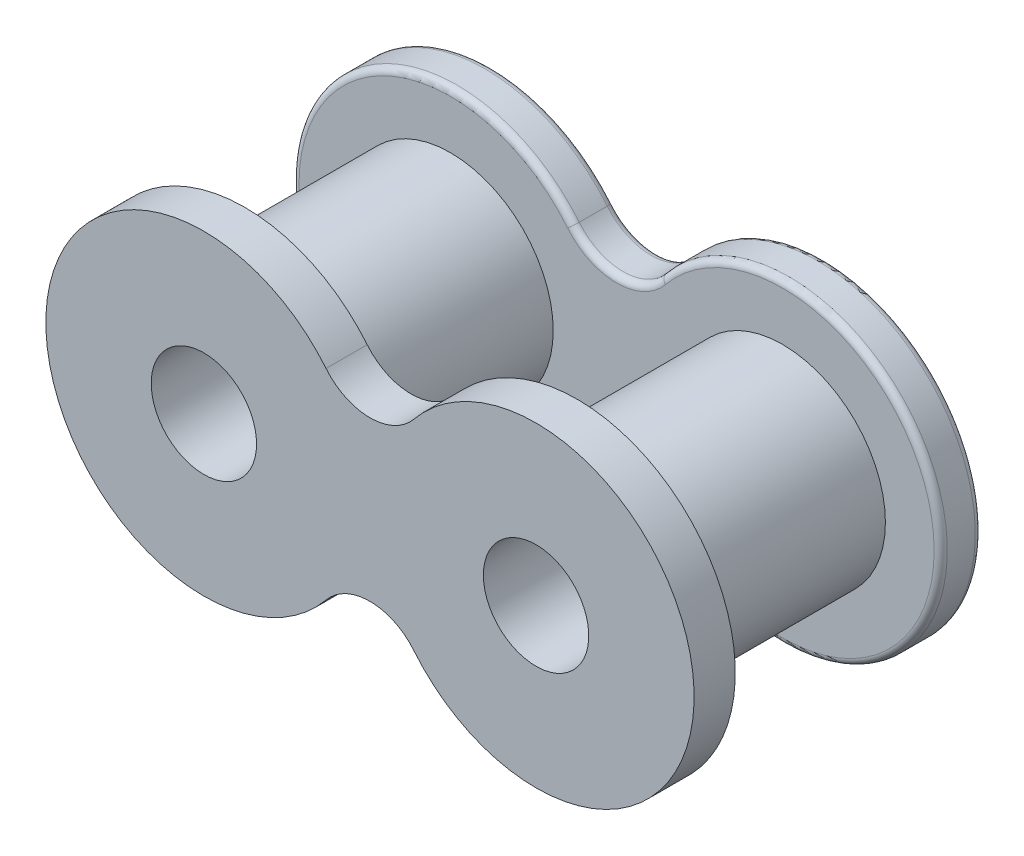
ISO-10303-21;
HEADER;
FILE_DESCRIPTION(('STEP AP214'),'2;1');
FILE_NAME('part.step','',(''),(''),'','','');
FILE_SCHEMA(('AUTOMOTIVE_DESIGN { 1 0 10303 214 1 1 1 1 }'));
ENDSEC;
DATA;
#1=APPLICATION_CONTEXT('core data for automotive mechanical design processes');
#2=APPLICATION_PROTOCOL_DEFINITION('international standard','automotive_design',2000,#1);
#3=PRODUCT_CONTEXT('',#1,'mechanical');
#4=PRODUCT('Part','Part','',(#3));
#5=PRODUCT_RELATED_PRODUCT_CATEGORY('part','',(#4));
#6=PRODUCT_DEFINITION_FORMATION('','',#4);
#7=PRODUCT_DEFINITION_CONTEXT('part definition',#1,'design');
#8=PRODUCT_DEFINITION('design','',#6,#7);
#9=PRODUCT_DEFINITION_SHAPE('','',#8);
#10=(LENGTH_UNIT() NAMED_UNIT(*) SI_UNIT(.MILLI.,.METRE.));
#11=(NAMED_UNIT(*) PLANE_ANGLE_UNIT() SI_UNIT($,.RADIAN.));
#12=(NAMED_UNIT(*) SI_UNIT($,.STERADIAN.) SOLID_ANGLE_UNIT());
#13=UNCERTAINTY_MEASURE_WITH_UNIT(LENGTH_MEASURE(1.E-05),#10,'distance_accuracy_value','');
#14=(GEOMETRIC_REPRESENTATION_CONTEXT(3) GLOBAL_UNCERTAINTY_ASSIGNED_CONTEXT((#13)) GLOBAL_UNIT_ASSIGNED_CONTEXT((#10,
#11,#12)) REPRESENTATION_CONTEXT('',''));
#15=CARTESIAN_POINT('',(0.,0.,0.));
#16=DIRECTION('',(0.,0.,1.));
#17=DIRECTION('',(1.,0.,0.));
#18=AXIS2_PLACEMENT_3D('',#15,#16,#17);
#19=CARTESIAN_POINT('',(3.20321277390089,2.62846689236439,1.5875));
#20=DIRECTION('',(0.,0.,1.));
#21=DIRECTION('',(1.,0.,0.));
#22=AXIS2_PLACEMENT_3D('',#19,#20,#21);
#23=PLANE('',#22);
#24=CARTESIAN_POINT('',(6.40642554780178,0.,1.5875));
#25=DIRECTION('',(0.,0.,1.));
#26=DIRECTION('',(1.,0.,0.));
#27=AXIS2_PLACEMENT_3D('',#24,#25,#26);
#28=CIRCLE('',#27,3.9624);
#29=CARTESIAN_POINT('',(10.3688255478018,0.,1.5875));
#30=VERTEX_POINT('',#29);
#31=EDGE_CURVE('E11',#30,#30,#28,.T.);
#32=ORIENTED_EDGE('',*,*,#31,.F.);
#33=EDGE_LOOP('',(#32));
#34=FACE_BOUND('',#33,.T.);
#35=CARTESIAN_POINT('',(-6.40642554780178,0.,1.5875));
#36=DIRECTION('',(0.,0.,1.));
#37=DIRECTION('',(1.,0.,0.));
#38=AXIS2_PLACEMENT_3D('',#35,#36,#37);
#39=CIRCLE('',#38,3.9624);
#40=CARTESIAN_POINT('',(-2.44402554780178,0.,1.5875));
#41=VERTEX_POINT('',#40);
#42=EDGE_CURVE('E176',#41,#41,#39,.T.);
#43=ORIENTED_EDGE('',*,*,#42,.F.);
#44=EDGE_LOOP('',(#43));
#45=FACE_BOUND('',#44,.T.);
#46=CARTESIAN_POINT('',(0.,-5.25693378472879,1.5875));
#47=DIRECTION('',(0.,0.,1.));
#48=DIRECTION('',(1.,0.,0.));
#49=AXIS2_PLACEMENT_3D('',#46,#47,#48);
#50=CIRCLE('',#49,2.4451974223226);
#51=CARTESIAN_POINT('',(-1.89026210400044,-3.70583752326953,1.5875));
#52=VERTEX_POINT('',#51);
#53=CARTESIAN_POINT('',(1.89026210400044,-3.70583752326953,1.5875));
#54=VERTEX_POINT('',#53);
#55=EDGE_CURVE('E48',#52,#54,#50,.F.);
#56=ORIENTED_EDGE('',*,*,#55,.T.);
#57=CARTESIAN_POINT('',(6.40642554780178,0.,1.5875));
#58=DIRECTION('',(0.,0.,1.));
#59=DIRECTION('',(1.,0.,0.));
#60=AXIS2_PLACEMENT_3D('',#57,#58,#59);
#61=CIRCLE('',#60,5.842);
#62=CARTESIAN_POINT('',(1.89026210400044,3.70583752326953,1.5875));
#63=VERTEX_POINT('',#62);
#64=EDGE_CURVE('E248',#54,#63,#61,.T.);
#65=ORIENTED_EDGE('',*,*,#64,.T.);
#66=CARTESIAN_POINT('',(0.,5.25693378472879,1.5875));
#67=DIRECTION('',(0.,0.,1.));
#68=DIRECTION('',(1.,0.,0.));
#69=AXIS2_PLACEMENT_3D('',#66,#67,#68);
#70=CIRCLE('',#69,2.4451974223226);
#71=CARTESIAN_POINT('',(-1.89026210400044,3.70583752326953,1.5875));
#72=VERTEX_POINT('',#71);
#73=EDGE_CURVE('E244',#63,#72,#70,.F.);
#74=ORIENTED_EDGE('',*,*,#73,.T.);
#75=CARTESIAN_POINT('',(-6.40642554780178,0.,1.5875));
#76=DIRECTION('',(0.,0.,1.));
#77=DIRECTION('',(1.,0.,0.));
#78=AXIS2_PLACEMENT_3D('',#75,#76,#77);
#79=CIRCLE('',#78,5.842);
#80=EDGE_CURVE('E53',#72,#52,#79,.T.);
#81=ORIENTED_EDGE('',*,*,#80,.T.);
#82=EDGE_LOOP('',(#56,#65,#74,#81));
#83=FACE_BOUND('',#82,.T.);
#84=ADVANCED_FACE('F33',(#34,#45,#83),#23,.T.);
#85=CARTESIAN_POINT('',(3.20321277390089,2.62846689236439,0.));
#86=DIRECTION('',(0.,0.,1.));
#87=DIRECTION('',(1.,0.,0.));
#88=AXIS2_PLACEMENT_3D('',#85,#86,#87);
#89=PLANE('',#88);
#90=CARTESIAN_POINT('',(6.40642554780178,0.,0.));
#91=DIRECTION('',(0.,0.,1.));
#92=DIRECTION('',(1.,0.,0.));
#93=AXIS2_PLACEMENT_3D('',#90,#91,#92);
#94=CIRCLE('',#93,2.286);
#95=CARTESIAN_POINT('',(8.69242554780178,0.,0.));
#96=VERTEX_POINT('',#95);
#97=EDGE_CURVE('E208',#96,#96,#94,.T.);
#98=ORIENTED_EDGE('',*,*,#97,.T.);
#99=EDGE_LOOP('',(#98));
#100=FACE_BOUND('',#99,.T.);
#101=CARTESIAN_POINT('',(-6.40642554780178,0.,0.));
#102=DIRECTION('',(0.,0.,1.));
#103=DIRECTION('',(1.,0.,0.));
#104=AXIS2_PLACEMENT_3D('',#101,#102,#103);
#105=CIRCLE('',#104,2.286);
#106=CARTESIAN_POINT('',(-4.12042554780178,0.,0.));
#107=VERTEX_POINT('',#106);
#108=EDGE_CURVE('E205',#107,#107,#105,.T.);
#109=ORIENTED_EDGE('',*,*,#108,.T.);
#110=EDGE_LOOP('',(#109));
#111=FACE_BOUND('',#110,.T.);
#112=CARTESIAN_POINT('',(0.,-5.25693378472879,0.));
#113=DIRECTION('',(0.,0.,1.));
#114=DIRECTION('',(1.,0.,0.));
#115=AXIS2_PLACEMENT_3D('',#112,#113,#114);
#116=CIRCLE('',#115,2.4451974223226);
#117=CARTESIAN_POINT('',(1.89026210400044,-3.70583752326953,0.));
#118=VERTEX_POINT('',#117);
#119=CARTESIAN_POINT('',(-1.89026210400044,-3.70583752326953,0.));
#120=VERTEX_POINT('',#119);
#121=EDGE_CURVE('E200',#118,#120,#116,.T.);
#122=ORIENTED_EDGE('',*,*,#121,.T.);
#123=CARTESIAN_POINT('',(-6.40642554780178,0.,0.));
#124=DIRECTION('',(0.,0.,1.));
#125=DIRECTION('',(1.,0.,0.));
#126=AXIS2_PLACEMENT_3D('',#123,#124,#125);
#127=CIRCLE('',#126,5.842);
#128=CARTESIAN_POINT('',(-1.89026210400044,3.70583752326953,0.));
#129=VERTEX_POINT('',#128);
#130=EDGE_CURVE('E202',#120,#129,#127,.F.);
#131=ORIENTED_EDGE('',*,*,#130,.T.);
#132=CARTESIAN_POINT('',(0.,5.25693378472879,0.));
#133=DIRECTION('',(0.,0.,1.));
#134=DIRECTION('',(1.,0.,0.));
#135=AXIS2_PLACEMENT_3D('',#132,#133,#134);
#136=CIRCLE('',#135,2.4451974223226);
#137=CARTESIAN_POINT('',(1.89026210400044,3.70583752326953,0.));
#138=VERTEX_POINT('',#137);
#139=EDGE_CURVE('E196',#129,#138,#136,.T.);
#140=ORIENTED_EDGE('',*,*,#139,.T.);
#141=CARTESIAN_POINT('',(6.40642554780178,0.,0.));
#142=DIRECTION('',(0.,0.,1.));
#143=DIRECTION('',(1.,0.,0.));
#144=AXIS2_PLACEMENT_3D('',#141,#142,#143);
#145=CIRCLE('',#144,5.842);
#146=EDGE_CURVE('E198',#138,#118,#145,.F.);
#147=ORIENTED_EDGE('',*,*,#146,.T.);
#148=EDGE_LOOP('',(#122,#131,#140,#147));
#149=FACE_BOUND('',#148,.T.);
#150=ADVANCED_FACE('F310',(#100,#111,#149),#89,.F.);
#151=CARTESIAN_POINT('',(0.,5.25693378472879,1.5875));
#152=DIRECTION('',(0.,0.,-1.));
#153=DIRECTION('',(-1.,0.,0.));
#154=AXIS2_PLACEMENT_3D('',#151,#152,#153);
#155=CYLINDRICAL_SURFACE('',#154,2.1911974223226);
#156=DIRECTION('',(0.,0.,-1.));
#157=VECTOR('',#156,1.);
#158=CARTESIAN_POINT('',(1.69390717166126,3.86696089384646,1.5875));
#159=LINE('',#158,#157);
#160=CARTESIAN_POINT('',(1.69390717166126,3.86696089384646,1.3335));
#161=VERTEX_POINT('',#160);
#162=CARTESIAN_POINT('',(1.69390717166126,3.86696089384646,0.254));
#163=VERTEX_POINT('',#162);
#164=EDGE_CURVE('E183',#161,#163,#159,.T.);
#165=ORIENTED_EDGE('',*,*,#164,.T.);
#166=CARTESIAN_POINT('',(0.,5.25693378472879,0.254));
#167=DIRECTION('',(0.,0.,1.));
#168=DIRECTION('',(1.,0.,0.));
#169=AXIS2_PLACEMENT_3D('',#166,#167,#168);
#170=CIRCLE('',#169,2.1911974223226);
#171=CARTESIAN_POINT('',(-1.69390717166125,3.86696089384646,0.254));
#172=VERTEX_POINT('',#171);
#173=EDGE_CURVE('E239',#163,#172,#170,.F.);
#174=ORIENTED_EDGE('',*,*,#173,.T.);
#175=DIRECTION('',(0.,0.,-1.));
#176=VECTOR('',#175,1.);
#177=CARTESIAN_POINT('',(-1.69390717166125,3.86696089384646,1.5875));
#178=LINE('',#177,#176);
#179=CARTESIAN_POINT('',(-1.69390717166125,3.86696089384646,1.3335));
#180=VERTEX_POINT('',#179);
#181=EDGE_CURVE('E193',#180,#172,#178,.T.);
#182=ORIENTED_EDGE('',*,*,#181,.F.);
#183=CARTESIAN_POINT('',(0.,5.25693378472879,1.3335));
#184=DIRECTION('',(0.,0.,1.));
#185=DIRECTION('',(1.,0.,0.));
#186=AXIS2_PLACEMENT_3D('',#183,#184,#185);
#187=CIRCLE('',#186,2.1911974223226);
#188=EDGE_CURVE('E237',#180,#161,#187,.T.);
#189=ORIENTED_EDGE('',*,*,#188,.T.);
#190=EDGE_LOOP('',(#165,#174,#182,#189));
#191=FACE_BOUND('',#190,.T.);
#192=ADVANCED_FACE('F282',(#191),#155,.F.);
#193=CARTESIAN_POINT('',(-6.40642554780178,0.,1.5875));
#194=DIRECTION('',(0.,0.,-1.));
#195=DIRECTION('',(-1.,0.,0.));
#196=AXIS2_PLACEMENT_3D('',#193,#194,#195);
#197=CYLINDRICAL_SURFACE('',#196,6.096);
#198=ORIENTED_EDGE('',*,*,#181,.T.);
#199=CARTESIAN_POINT('',(-6.40642554780178,0.,0.254));
#200=DIRECTION('',(0.,0.,1.));
#201=DIRECTION('',(1.,0.,0.));
#202=AXIS2_PLACEMENT_3D('',#199,#200,#201);
#203=CIRCLE('',#202,6.096);
#204=CARTESIAN_POINT('',(-1.69390717166126,-3.86696089384646,0.254));
#205=VERTEX_POINT('',#204);
#206=EDGE_CURVE('E225',#172,#205,#203,.T.);
#207=ORIENTED_EDGE('',*,*,#206,.T.);
#208=DIRECTION('',(0.,0.,-1.));
#209=VECTOR('',#208,1.);
#210=CARTESIAN_POINT('',(-1.69390717166126,-3.86696089384646,1.5875));
#211=LINE('',#210,#209);
#212=CARTESIAN_POINT('',(-1.69390717166126,-3.86696089384646,1.3335));
#213=VERTEX_POINT('',#212);
#214=EDGE_CURVE('E190',#213,#205,#211,.T.);
#215=ORIENTED_EDGE('',*,*,#214,.F.);
#216=CARTESIAN_POINT('',(-6.40642554780178,0.,1.3335));
#217=DIRECTION('',(0.,0.,1.));
#218=DIRECTION('',(1.,0.,0.));
#219=AXIS2_PLACEMENT_3D('',#216,#217,#218);
#220=CIRCLE('',#219,6.096);
#221=EDGE_CURVE('E223',#213,#180,#220,.F.);
#222=ORIENTED_EDGE('',*,*,#221,.T.);
#223=EDGE_LOOP('',(#198,#207,#215,#222));
#224=FACE_BOUND('',#223,.T.);
#225=ADVANCED_FACE('F279',(#224),#197,.T.);
#226=CARTESIAN_POINT('',(0.,-5.25693378472879,1.5875));
#227=DIRECTION('',(0.,0.,-1.));
#228=DIRECTION('',(-1.,0.,0.));
#229=AXIS2_PLACEMENT_3D('',#226,#227,#228);
#230=CYLINDRICAL_SURFACE('',#229,2.1911974223226);
#231=ORIENTED_EDGE('',*,*,#214,.T.);
#232=CARTESIAN_POINT('',(0.,-5.25693378472879,0.254));
#233=DIRECTION('',(0.,0.,1.));
#234=DIRECTION('',(1.,0.,0.));
#235=AXIS2_PLACEMENT_3D('',#232,#233,#234);
#236=CIRCLE('',#235,2.1911974223226);
#237=CARTESIAN_POINT('',(1.69390717166126,-3.86696089384646,0.254));
#238=VERTEX_POINT('',#237);
#239=EDGE_CURVE('E230',#205,#238,#236,.F.);
#240=ORIENTED_EDGE('',*,*,#239,.T.);
#241=DIRECTION('',(0.,0.,-1.));
#242=VECTOR('',#241,1.);
#243=CARTESIAN_POINT('',(1.69390717166126,-3.86696089384646,1.5875));
#244=LINE('',#243,#242);
#245=CARTESIAN_POINT('',(1.69390717166126,-3.86696089384646,1.3335));
#246=VERTEX_POINT('',#245);
#247=EDGE_CURVE('E186',#246,#238,#244,.T.);
#248=ORIENTED_EDGE('',*,*,#247,.F.);
#249=CARTESIAN_POINT('',(0.,-5.25693378472879,1.3335));
#250=DIRECTION('',(0.,0.,1.));
#251=DIRECTION('',(1.,0.,0.));
#252=AXIS2_PLACEMENT_3D('',#249,#250,#251);
#253=CIRCLE('',#252,2.1911974223226);
#254=EDGE_CURVE('E228',#246,#213,#253,.T.);
#255=ORIENTED_EDGE('',*,*,#254,.T.);
#256=EDGE_LOOP('',(#231,#240,#248,#255));
#257=FACE_BOUND('',#256,.T.);
#258=ADVANCED_FACE('F296',(#257),#230,.F.);
#259=CARTESIAN_POINT('',(6.40642554780178,0.,1.5875));
#260=DIRECTION('',(0.,0.,-1.));
#261=DIRECTION('',(-1.,0.,0.));
#262=AXIS2_PLACEMENT_3D('',#259,#260,#261);
#263=CYLINDRICAL_SURFACE('',#262,6.096);
#264=ORIENTED_EDGE('',*,*,#247,.T.);
#265=CARTESIAN_POINT('',(6.40642554780178,0.,0.254));
#266=DIRECTION('',(0.,0.,1.));
#267=DIRECTION('',(1.,0.,0.));
#268=AXIS2_PLACEMENT_3D('',#265,#266,#267);
#269=CIRCLE('',#268,6.096);
#270=EDGE_CURVE('E235',#238,#163,#269,.T.);
#271=ORIENTED_EDGE('',*,*,#270,.T.);
#272=ORIENTED_EDGE('',*,*,#164,.F.);
#273=CARTESIAN_POINT('',(6.40642554780178,0.,1.3335));
#274=DIRECTION('',(0.,0.,1.));
#275=DIRECTION('',(1.,0.,0.));
#276=AXIS2_PLACEMENT_3D('',#273,#274,#275);
#277=CIRCLE('',#276,6.096);
#278=EDGE_CURVE('E232',#161,#246,#277,.F.);
#279=ORIENTED_EDGE('',*,*,#278,.T.);
#280=EDGE_LOOP('',(#264,#271,#272,#279));
#281=FACE_BOUND('',#280,.T.);
#282=ADVANCED_FACE('F300',(#281),#263,.T.);
#283=CARTESIAN_POINT('',(-6.40642554780178,0.,1.5875));
#284=DIRECTION('',(0.,0.,-1.));
#285=DIRECTION('',(-1.,0.,0.));
#286=AXIS2_PLACEMENT_3D('',#283,#284,#285);
#287=CYLINDRICAL_SURFACE('',#286,2.032);
#288=CARTESIAN_POINT('',(-6.40642554780178,0.,0.254));
#289=DIRECTION('',(0.,0.,1.));
#290=DIRECTION('',(1.,0.,0.));
#291=AXIS2_PLACEMENT_3D('',#288,#289,#290);
#292=CIRCLE('',#291,2.032);
#293=CARTESIAN_POINT('',(-4.37442554780178,0.,0.254));
#294=VERTEX_POINT('',#293);
#295=EDGE_CURVE('E220',#294,#294,#292,.F.);
#296=ORIENTED_EDGE('',*,*,#295,.T.);
#297=EDGE_LOOP('',(#296));
#298=FACE_BOUND('',#297,.T.);
#299=CARTESIAN_POINT('',(-6.40642554780178,0.,1.3335));
#300=DIRECTION('',(0.,0.,1.));
#301=DIRECTION('',(1.,0.,0.));
#302=AXIS2_PLACEMENT_3D('',#299,#300,#301);
#303=CIRCLE('',#302,2.032);
#304=CARTESIAN_POINT('',(-4.37442554780178,0.,1.3335));
#305=VERTEX_POINT('',#304);
#306=EDGE_CURVE('E217',#305,#305,#303,.T.);
#307=ORIENTED_EDGE('',*,*,#306,.T.);
#308=EDGE_LOOP('',(#307));
#309=FACE_BOUND('',#308,.T.);
#310=ADVANCED_FACE('F326',(#298,#309),#287,.F.);
#311=CARTESIAN_POINT('',(6.40642554780178,0.,1.5875));
#312=DIRECTION('',(0.,0.,-1.));
#313=DIRECTION('',(-1.,0.,0.));
#314=AXIS2_PLACEMENT_3D('',#311,#312,#313);
#315=CYLINDRICAL_SURFACE('',#314,2.032);
#316=CARTESIAN_POINT('',(6.40642554780178,0.,0.254));
#317=DIRECTION('',(0.,0.,1.));
#318=DIRECTION('',(1.,0.,0.));
#319=AXIS2_PLACEMENT_3D('',#316,#317,#318);
#320=CIRCLE('',#319,2.032);
#321=CARTESIAN_POINT('',(8.43842554780178,0.,0.254));
#322=VERTEX_POINT('',#321);
#323=EDGE_CURVE('E214',#322,#322,#320,.F.);
#324=ORIENTED_EDGE('',*,*,#323,.T.);
#325=EDGE_LOOP('',(#324));
#326=FACE_BOUND('',#325,.T.);
#327=CARTESIAN_POINT('',(6.40642554780178,0.,1.3335));
#328=DIRECTION('',(0.,0.,1.));
#329=DIRECTION('',(1.,0.,0.));
#330=AXIS2_PLACEMENT_3D('',#327,#328,#329);
#331=CIRCLE('',#330,2.032);
#332=CARTESIAN_POINT('',(8.43842554780178,0.,1.3335));
#333=VERTEX_POINT('',#332);
#334=EDGE_CURVE('E211',#333,#333,#331,.T.);
#335=ORIENTED_EDGE('',*,*,#334,.T.);
#336=EDGE_LOOP('',(#335));
#337=FACE_BOUND('',#336,.T.);
#338=ADVANCED_FACE('F335',(#326,#337),#315,.F.);
#339=CARTESIAN_POINT('',(6.40642554780178,0.,0.254));
#340=DIRECTION('',(0.,0.,1.));
#341=DIRECTION('',(1.,0.,0.));
#342=AXIS2_PLACEMENT_3D('',#339,#340,#341);
#343=TOROIDAL_SURFACE('',#342,2.286,0.254);
#344=ORIENTED_EDGE('',*,*,#323,.F.);
#345=EDGE_LOOP('',(#344));
#346=FACE_BOUND('',#345,.T.);
#347=ORIENTED_EDGE('',*,*,#97,.F.);
#348=EDGE_LOOP('',(#347));
#349=FACE_BOUND('',#348,.T.);
#350=ADVANCED_FACE('F331',(#346,#349),#343,.T.);
#351=CARTESIAN_POINT('',(-6.40642554780178,0.,0.254));
#352=DIRECTION('',(0.,0.,1.));
#353=DIRECTION('',(1.,0.,0.));
#354=AXIS2_PLACEMENT_3D('',#351,#352,#353);
#355=TOROIDAL_SURFACE('',#354,2.286,0.254);
#356=ORIENTED_EDGE('',*,*,#295,.F.);
#357=EDGE_LOOP('',(#356));
#358=FACE_BOUND('',#357,.T.);
#359=ORIENTED_EDGE('',*,*,#108,.F.);
#360=EDGE_LOOP('',(#359));
#361=FACE_BOUND('',#360,.T.);
#362=ADVANCED_FACE('F334',(#358,#361),#355,.T.);
#363=CARTESIAN_POINT('',(6.40642554780178,0.,0.254));
#364=DIRECTION('',(0.,0.,1.));
#365=DIRECTION('',(1.,0.,0.));
#366=AXIS2_PLACEMENT_3D('',#363,#364,#365);
#367=TOROIDAL_SURFACE('',#366,5.842,0.254);
#368=CARTESIAN_POINT('',(1.89026210400044,-3.70583752326953,0.254));
#369=DIRECTION('',(-0.634343978649354,0.773050914721216,0.));
#370=DIRECTION('',(-0.773050914721216,-0.634343978649354,0.));
#371=AXIS2_PLACEMENT_3D('',#368,#369,#370);
#372=CIRCLE('',#371,0.254);
#373=EDGE_CURVE('E257',#118,#238,#372,.T.);
#374=ORIENTED_EDGE('',*,*,#373,.F.);
#375=ORIENTED_EDGE('',*,*,#146,.F.);
#376=CARTESIAN_POINT('',(1.89026210400044,3.70583752326953,0.254));
#377=DIRECTION('',(-0.634343978649354,-0.773050914721215,0.));
#378=DIRECTION('',(0.773050914721215,-0.634343978649354,0.));
#379=AXIS2_PLACEMENT_3D('',#376,#377,#378);
#380=CIRCLE('',#379,0.254);
#381=EDGE_CURVE('E187',#163,#138,#380,.T.);
#382=ORIENTED_EDGE('',*,*,#381,.F.);
#383=ORIENTED_EDGE('',*,*,#270,.F.);
#384=EDGE_LOOP('',(#374,#375,#382,#383));
#385=FACE_BOUND('',#384,.T.);
#386=ADVANCED_FACE('F304',(#385),#367,.T.);
#387=CARTESIAN_POINT('',(0.,5.25693378472879,0.254));
#388=DIRECTION('',(0.,0.,1.));
#389=DIRECTION('',(1.,0.,0.));
#390=AXIS2_PLACEMENT_3D('',#387,#388,#389);
#391=TOROIDAL_SURFACE('',#390,2.4451974223226,0.254);
#392=ORIENTED_EDGE('',*,*,#381,.T.);
#393=ORIENTED_EDGE('',*,*,#139,.F.);
#394=CARTESIAN_POINT('',(-1.89026210400044,3.70583752326953,0.254));
#395=DIRECTION('',(-0.634343978649354,0.773050914721215,0.));
#396=DIRECTION('',(-0.773050914721215,-0.634343978649354,0.));
#397=AXIS2_PLACEMENT_3D('',#394,#395,#396);
#398=CIRCLE('',#397,0.254);
#399=EDGE_CURVE('E254',#172,#129,#398,.T.);
#400=ORIENTED_EDGE('',*,*,#399,.F.);
#401=ORIENTED_EDGE('',*,*,#173,.F.);
#402=EDGE_LOOP('',(#392,#393,#400,#401));
#403=FACE_BOUND('',#402,.T.);
#404=ADVANCED_FACE('F287',(#403),#391,.T.);
#405=CARTESIAN_POINT('',(0.,-5.25693378472879,0.254));
#406=DIRECTION('',(0.,0.,1.));
#407=DIRECTION('',(1.,0.,0.));
#408=AXIS2_PLACEMENT_3D('',#405,#406,#407);
#409=TOROIDAL_SURFACE('',#408,2.4451974223226,0.254);
#410=ORIENTED_EDGE('',*,*,#373,.T.);
#411=ORIENTED_EDGE('',*,*,#239,.F.);
#412=CARTESIAN_POINT('',(-1.89026210400044,-3.70583752326953,0.254));
#413=DIRECTION('',(-0.634343978649354,-0.773050914721215,0.));
#414=DIRECTION('',(0.773050914721215,-0.634343978649354,0.));
#415=AXIS2_PLACEMENT_3D('',#412,#413,#414);
#416=CIRCLE('',#415,0.254);
#417=EDGE_CURVE('E252',#120,#205,#416,.T.);
#418=ORIENTED_EDGE('',*,*,#417,.F.);
#419=ORIENTED_EDGE('',*,*,#121,.F.);
#420=EDGE_LOOP('',(#410,#411,#418,#419));
#421=FACE_BOUND('',#420,.T.);
#422=ADVANCED_FACE('F308',(#421),#409,.T.);
#423=CARTESIAN_POINT('',(-6.40642554780178,0.,0.254));
#424=DIRECTION('',(0.,0.,1.));
#425=DIRECTION('',(1.,0.,0.));
#426=AXIS2_PLACEMENT_3D('',#423,#424,#425);
#427=TOROIDAL_SURFACE('',#426,5.842,0.254);
#428=ORIENTED_EDGE('',*,*,#399,.T.);
#429=ORIENTED_EDGE('',*,*,#130,.F.);
#430=ORIENTED_EDGE('',*,*,#417,.T.);
#431=ORIENTED_EDGE('',*,*,#206,.F.);
#432=EDGE_LOOP('',(#428,#429,#430,#431));
#433=FACE_BOUND('',#432,.T.);
#434=ADVANCED_FACE('F292',(#433),#427,.T.);
#435=CARTESIAN_POINT('',(6.40642554780178,0.,1.3335));
#436=DIRECTION('',(0.,0.,1.));
#437=DIRECTION('',(1.,0.,0.));
#438=AXIS2_PLACEMENT_3D('',#435,#436,#437);
#439=TOROIDAL_SURFACE('',#438,2.286,0.254);
#440=CARTESIAN_POINT('',(6.40642554780178,0.,1.5875));
#441=DIRECTION('',(0.,0.,1.));
#442=DIRECTION('',(1.,0.,0.));
#443=AXIS2_PLACEMENT_3D('',#440,#441,#442);
#444=CIRCLE('',#443,2.286);
#445=CARTESIAN_POINT('',(8.69242554780178,0.,1.5875));
#446=VERTEX_POINT('',#445);
#447=EDGE_CURVE('E41',#446,#446,#444,.F.);
#448=ORIENTED_EDGE('',*,*,#447,.F.);
#449=EDGE_LOOP('',(#448));
#450=FACE_BOUND('',#449,.T.);
#451=ORIENTED_EDGE('',*,*,#334,.F.);
#452=EDGE_LOOP('',(#451));
#453=FACE_BOUND('',#452,.T.);
#454=ADVANCED_FACE('F342',(#450,#453),#439,.T.);
#455=CARTESIAN_POINT('',(-6.40642554780178,0.,1.3335));
#456=DIRECTION('',(0.,0.,1.));
#457=DIRECTION('',(1.,0.,0.));
#458=AXIS2_PLACEMENT_3D('',#455,#456,#457);
#459=TOROIDAL_SURFACE('',#458,5.842,0.254);
#460=CARTESIAN_POINT('',(-1.89026210400044,3.70583752326953,1.3335));
#461=DIRECTION('',(0.634343978649354,-0.773050914721215,0.));
#462=DIRECTION('',(0.773050914721215,0.634343978649354,0.));
#463=AXIS2_PLACEMENT_3D('',#460,#461,#462);
#464=CIRCLE('',#463,0.254);
#465=EDGE_CURVE('E265',#180,#72,#464,.T.);
#466=ORIENTED_EDGE('',*,*,#465,.F.);
#467=ORIENTED_EDGE('',*,*,#221,.F.);
#468=CARTESIAN_POINT('',(-1.89026210400044,-3.70583752326953,1.3335));
#469=DIRECTION('',(0.634343978649354,0.773050914721216,0.));
#470=DIRECTION('',(-0.773050914721216,0.634343978649354,0.));
#471=AXIS2_PLACEMENT_3D('',#468,#469,#470);
#472=CIRCLE('',#471,0.254);
#473=EDGE_CURVE('E255',#52,#213,#472,.T.);
#474=ORIENTED_EDGE('',*,*,#473,.F.);
#475=ORIENTED_EDGE('',*,*,#80,.F.);
#476=EDGE_LOOP('',(#466,#467,#474,#475));
#477=FACE_BOUND('',#476,.T.);
#478=ADVANCED_FACE('F274',(#477),#459,.T.);
#479=CARTESIAN_POINT('',(0.,-5.25693378472879,1.3335));
#480=DIRECTION('',(0.,0.,1.));
#481=DIRECTION('',(1.,0.,0.));
#482=AXIS2_PLACEMENT_3D('',#479,#480,#481);
#483=TOROIDAL_SURFACE('',#482,2.4451974223226,0.254);
#484=ORIENTED_EDGE('',*,*,#473,.T.);
#485=ORIENTED_EDGE('',*,*,#254,.F.);
#486=CARTESIAN_POINT('',(1.89026210400044,-3.70583752326953,1.3335));
#487=DIRECTION('',(0.634343978649354,-0.773050914721215,0.));
#488=DIRECTION('',(0.773050914721215,0.634343978649354,0.));
#489=AXIS2_PLACEMENT_3D('',#486,#487,#488);
#490=CIRCLE('',#489,0.254);
#491=EDGE_CURVE('E263',#54,#246,#490,.T.);
#492=ORIENTED_EDGE('',*,*,#491,.F.);
#493=ORIENTED_EDGE('',*,*,#55,.F.);
#494=EDGE_LOOP('',(#484,#485,#492,#493));
#495=FACE_BOUND('',#494,.T.);
#496=ADVANCED_FACE('F270',(#495),#483,.T.);
#497=CARTESIAN_POINT('',(0.,5.25693378472879,1.3335));
#498=DIRECTION('',(0.,0.,1.));
#499=DIRECTION('',(1.,0.,0.));
#500=AXIS2_PLACEMENT_3D('',#497,#498,#499);
#501=TOROIDAL_SURFACE('',#500,2.4451974223226,0.254);
#502=ORIENTED_EDGE('',*,*,#465,.T.);
#503=ORIENTED_EDGE('',*,*,#73,.F.);
#504=CARTESIAN_POINT('',(1.89026210400044,3.70583752326953,1.3335));
#505=DIRECTION('',(0.634343978649354,0.773050914721216,0.));
#506=DIRECTION('',(-0.773050914721216,0.634343978649354,0.));
#507=AXIS2_PLACEMENT_3D('',#504,#505,#506);
#508=CIRCLE('',#507,0.254);
#509=EDGE_CURVE('E180',#161,#63,#508,.T.);
#510=ORIENTED_EDGE('',*,*,#509,.F.);
#511=ORIENTED_EDGE('',*,*,#188,.F.);
#512=EDGE_LOOP('',(#502,#503,#510,#511));
#513=FACE_BOUND('',#512,.T.);
#514=ADVANCED_FACE('F355',(#513),#501,.T.);
#515=CARTESIAN_POINT('',(6.40642554780178,0.,1.3335));
#516=DIRECTION('',(0.,0.,1.));
#517=DIRECTION('',(1.,0.,0.));
#518=AXIS2_PLACEMENT_3D('',#515,#516,#517);
#519=TOROIDAL_SURFACE('',#518,5.842,0.254);
#520=ORIENTED_EDGE('',*,*,#491,.T.);
#521=ORIENTED_EDGE('',*,*,#278,.F.);
#522=ORIENTED_EDGE('',*,*,#509,.T.);
#523=ORIENTED_EDGE('',*,*,#64,.F.);
#524=EDGE_LOOP('',(#520,#521,#522,#523));
#525=FACE_BOUND('',#524,.T.);
#526=ADVANCED_FACE('F352',(#525),#519,.T.);
#527=CARTESIAN_POINT('',(-6.40642554780178,0.,1.3335));
#528=DIRECTION('',(0.,0.,1.));
#529=DIRECTION('',(1.,0.,0.));
#530=AXIS2_PLACEMENT_3D('',#527,#528,#529);
#531=TOROIDAL_SURFACE('',#530,2.286,0.254);
#532=CARTESIAN_POINT('',(-6.40642554780178,0.,1.5875));
#533=DIRECTION('',(0.,0.,1.));
#534=DIRECTION('',(1.,0.,0.));
#535=AXIS2_PLACEMENT_3D('',#532,#533,#534);
#536=CIRCLE('',#535,2.286);
#537=CARTESIAN_POINT('',(-4.12042554780178,0.,1.5875));
#538=VERTEX_POINT('',#537);
#539=EDGE_CURVE('E241',#538,#538,#536,.F.);
#540=ORIENTED_EDGE('',*,*,#539,.F.);
#541=EDGE_LOOP('',(#540));
#542=FACE_BOUND('',#541,.T.);
#543=ORIENTED_EDGE('',*,*,#306,.F.);
#544=EDGE_LOOP('',(#543));
#545=FACE_BOUND('',#544,.T.);
#546=ADVANCED_FACE('F35',(#542,#545),#531,.T.);
#547=CARTESIAN_POINT('',(-6.40642554780178,0.,1.5875));
#548=DIRECTION('',(0.,0.,1.));
#549=DIRECTION('',(1.,0.,0.));
#550=AXIS2_PLACEMENT_3D('',#547,#548,#549);
#551=PLANE('',#550);
#552=CARTESIAN_POINT('',(-6.40642554780178,0.,1.5875));
#553=DIRECTION('',(0.,0.,1.));
#554=DIRECTION('',(1.,0.,0.));
#555=AXIS2_PLACEMENT_3D('',#552,#553,#554);
#556=CIRCLE('',#555,2.032);
#557=CARTESIAN_POINT('',(-4.37442554780178,0.,1.5875));
#558=VERTEX_POINT('',#557);
#559=EDGE_CURVE('E173',#558,#558,#556,.T.);
#560=ORIENTED_EDGE('',*,*,#559,.T.);
#561=EDGE_LOOP('',(#560));
#562=FACE_BOUND('',#561,.T.);
#563=ORIENTED_EDGE('',*,*,#539,.T.);
#564=EDGE_LOOP('',(#563));
#565=FACE_BOUND('',#564,.T.);
#566=ADVANCED_FACE('F384',(#562,#565),#551,.F.);
#567=CARTESIAN_POINT('',(-6.40642554780178,0.,9.5123));
#568=DIRECTION('',(0.,0.,-1.));
#569=DIRECTION('',(-1.,0.,0.));
#570=AXIS2_PLACEMENT_3D('',#567,#568,#569);
#571=CYLINDRICAL_SURFACE('',#570,3.9624);
#572=CARTESIAN_POINT('',(-6.40642554780178,0.,9.5123));
#573=DIRECTION('',(0.,0.,1.));
#574=DIRECTION('',(1.,0.,0.));
#575=AXIS2_PLACEMENT_3D('',#572,#573,#574);
#576=CIRCLE('',#575,3.9624);
#577=CARTESIAN_POINT('',(-2.44402554780178,0.,9.5123));
#578=VERTEX_POINT('',#577);
#579=EDGE_CURVE('E177',#578,#578,#576,.T.);
#580=ORIENTED_EDGE('',*,*,#579,.F.);
#581=EDGE_LOOP('',(#580));
#582=FACE_BOUND('',#581,.T.);
#583=ORIENTED_EDGE('',*,*,#42,.T.);
#584=EDGE_LOOP('',(#583));
#585=FACE_BOUND('',#584,.T.);
#586=ADVANCED_FACE('F391',(#582,#585),#571,.T.);
#587=CARTESIAN_POINT('',(-6.40642554780178,0.,9.5123));
#588=DIRECTION('',(0.,0.,-1.));
#589=DIRECTION('',(-1.,0.,0.));
#590=AXIS2_PLACEMENT_3D('',#587,#588,#589);
#591=CYLINDRICAL_SURFACE('',#590,2.032);
#592=ORIENTED_EDGE('',*,*,#559,.F.);
#593=EDGE_LOOP('',(#592));
#594=FACE_BOUND('',#593,.T.);
#595=CARTESIAN_POINT('',(-6.40642554780178,0.,11.0998));
#596=DIRECTION('',(0.,0.,1.));
#597=DIRECTION('',(1.,0.,0.));
#598=AXIS2_PLACEMENT_3D('',#595,#596,#597);
#599=CIRCLE('',#598,2.032);
#600=CARTESIAN_POINT('',(-4.37442554780178,0.,11.0998));
#601=VERTEX_POINT('',#600);
#602=EDGE_CURVE('E157',#601,#601,#599,.T.);
#603=ORIENTED_EDGE('',*,*,#602,.T.);
#604=EDGE_LOOP('',(#603));
#605=FACE_BOUND('',#604,.T.);
#606=ADVANCED_FACE('F399',(#594,#605),#591,.F.);
#607=CARTESIAN_POINT('',(6.40642554780178,0.,1.5875));
#608=DIRECTION('',(0.,0.,1.));
#609=DIRECTION('',(-1.,0.,0.));
#610=AXIS2_PLACEMENT_3D('',#607,#608,#609);
#611=PLANE('',#610);
#612=CARTESIAN_POINT('',(6.40642554780178,0.,1.5875));
#613=DIRECTION('',(0.,0.,-1.));
#614=DIRECTION('',(-1.,0.,0.));
#615=AXIS2_PLACEMENT_3D('',#612,#613,#614);
#616=CIRCLE('',#615,2.032);
#617=CARTESIAN_POINT('',(4.37442554780178,0.,1.5875));
#618=VERTEX_POINT('',#617);
#619=EDGE_CURVE('E170',#618,#618,#616,.T.);
#620=ORIENTED_EDGE('',*,*,#619,.F.);
#621=EDGE_LOOP('',(#620));
#622=FACE_BOUND('',#621,.T.);
#623=ORIENTED_EDGE('',*,*,#447,.T.);
#624=EDGE_LOOP('',(#623));
#625=FACE_BOUND('',#624,.T.);
#626=ADVANCED_FACE('F408',(#622,#625),#611,.F.);
#627=CARTESIAN_POINT('',(6.40642554780178,0.,9.5123));
#628=DIRECTION('',(0.,0.,-1.));
#629=DIRECTION('',(-1.,0.,0.));
#630=AXIS2_PLACEMENT_3D('',#627,#628,#629);
#631=CYLINDRICAL_SURFACE('',#630,3.9624);
#632=CARTESIAN_POINT('',(6.40642554780178,0.,9.5123));
#633=DIRECTION('',(0.,0.,-1.));
#634=DIRECTION('',(-1.,0.,0.));
#635=AXIS2_PLACEMENT_3D('',#632,#633,#634);
#636=CIRCLE('',#635,3.9624);
#637=CARTESIAN_POINT('',(2.44402554780178,0.,9.5123));
#638=VERTEX_POINT('',#637);
#639=EDGE_CURVE('E133',#638,#638,#636,.F.);
#640=ORIENTED_EDGE('',*,*,#639,.F.);
#641=EDGE_LOOP('',(#640));
#642=FACE_BOUND('',#641,.T.);
#643=ORIENTED_EDGE('',*,*,#31,.T.);
#644=EDGE_LOOP('',(#643));
#645=FACE_BOUND('',#644,.T.);
#646=ADVANCED_FACE('F418',(#642,#645),#631,.T.);
#647=CARTESIAN_POINT('',(6.40642554780178,0.,9.5123));
#648=DIRECTION('',(0.,0.,-1.));
#649=DIRECTION('',(-1.,0.,0.));
#650=AXIS2_PLACEMENT_3D('',#647,#648,#649);
#651=CYLINDRICAL_SURFACE('',#650,2.032);
#652=ORIENTED_EDGE('',*,*,#619,.T.);
#653=EDGE_LOOP('',(#652));
#654=FACE_BOUND('',#653,.T.);
#655=CARTESIAN_POINT('',(6.40642554780178,0.,11.0998));
#656=DIRECTION('',(0.,0.,1.));
#657=DIRECTION('',(-1.,0.,0.));
#658=AXIS2_PLACEMENT_3D('',#655,#656,#657);
#659=CIRCLE('',#658,2.032);
#660=CARTESIAN_POINT('',(4.37442554780178,0.,11.0998));
#661=VERTEX_POINT('',#660);
#662=EDGE_CURVE('E622',#661,#661,#659,.T.);
#663=ORIENTED_EDGE('',*,*,#662,.T.);
#664=EDGE_LOOP('',(#663));
#665=FACE_BOUND('',#664,.T.);
#666=ADVANCED_FACE('F425',(#654,#665),#651,.F.);
#667=CARTESIAN_POINT('',(3.20321277390089,2.62846689236439,9.5123));
#668=DIRECTION('',(0.,0.,-1.));
#669=DIRECTION('',(1.,0.,0.));
#670=AXIS2_PLACEMENT_3D('',#667,#668,#669);
#671=PLANE('',#670);
#672=CARTESIAN_POINT('',(0.,5.25693378472879,9.5123));
#673=DIRECTION('',(0.,0.,-1.));
#674=DIRECTION('',(1.,0.,0.));
#675=AXIS2_PLACEMENT_3D('',#672,#673,#674);
#676=CIRCLE('',#675,2.1911974223226);
#677=CARTESIAN_POINT('',(1.69390717166126,3.86696089384646,9.5123));
#678=VERTEX_POINT('',#677);
#679=CARTESIAN_POINT('',(-1.69390717166125,3.86696089384646,9.5123));
#680=VERTEX_POINT('',#679);
#681=EDGE_CURVE('E125',#678,#680,#676,.T.);
#682=ORIENTED_EDGE('',*,*,#681,.F.);
#683=CARTESIAN_POINT('',(6.40642554780178,0.,9.5123));
#684=DIRECTION('',(0.,0.,1.));
#685=DIRECTION('',(-1.,0.,0.));
#686=AXIS2_PLACEMENT_3D('',#683,#684,#685);
#687=CIRCLE('',#686,6.096);
#688=CARTESIAN_POINT('',(1.69390717166126,-3.86696089384646,9.5123));
#689=VERTEX_POINT('',#688);
#690=EDGE_CURVE('E141',#689,#678,#687,.T.);
#691=ORIENTED_EDGE('',*,*,#690,.F.);
#692=CARTESIAN_POINT('',(0.,-5.25693378472879,9.5123));
#693=DIRECTION('',(0.,0.,-1.));
#694=DIRECTION('',(-1.,0.,0.));
#695=AXIS2_PLACEMENT_3D('',#692,#693,#694);
#696=CIRCLE('',#695,2.1911974223226);
#697=CARTESIAN_POINT('',(-1.69390717166126,-3.86696089384646,9.5123));
#698=VERTEX_POINT('',#697);
#699=EDGE_CURVE('E148',#698,#689,#696,.T.);
#700=ORIENTED_EDGE('',*,*,#699,.F.);
#701=CARTESIAN_POINT('',(-6.40642554780178,0.,9.5123));
#702=DIRECTION('',(0.,0.,1.));
#703=DIRECTION('',(1.,0.,0.));
#704=AXIS2_PLACEMENT_3D('',#701,#702,#703);
#705=CIRCLE('',#704,6.096);
#706=EDGE_CURVE('E144',#680,#698,#705,.T.);
#707=ORIENTED_EDGE('',*,*,#706,.F.);
#708=EDGE_LOOP('',(#682,#691,#700,#707));
#709=FACE_BOUND('',#708,.T.);
#710=ORIENTED_EDGE('',*,*,#639,.T.);
#711=EDGE_LOOP('',(#710));
#712=FACE_BOUND('',#711,.T.);
#713=ORIENTED_EDGE('',*,*,#579,.T.);
#714=EDGE_LOOP('',(#713));
#715=FACE_BOUND('',#714,.T.);
#716=ADVANCED_FACE('F138',(#709,#712,#715),#671,.T.);
#717=CARTESIAN_POINT('',(0.,5.25693378472879,9.5123));
#718=DIRECTION('',(0.,0.,1.));
#719=DIRECTION('',(1.,0.,0.));
#720=AXIS2_PLACEMENT_3D('',#717,#718,#719);
#721=CYLINDRICAL_SURFACE('',#720,2.1911974223226);
#722=CARTESIAN_POINT('',(0.,5.25693378472879,11.0998));
#723=DIRECTION('',(0.,0.,-1.));
#724=DIRECTION('',(1.,0.,0.));
#725=AXIS2_PLACEMENT_3D('',#722,#723,#724);
#726=CIRCLE('',#725,2.1911974223226);
#727=CARTESIAN_POINT('',(1.69390717166126,3.86696089384646,11.0998));
#728=VERTEX_POINT('',#727);
#729=CARTESIAN_POINT('',(-1.69390717166125,3.86696089384646,11.0998));
#730=VERTEX_POINT('',#729);
#731=EDGE_CURVE('E128',#728,#730,#726,.T.);
#732=ORIENTED_EDGE('',*,*,#731,.F.);
#733=DIRECTION('',(0.,0.,1.));
#734=VECTOR('',#733,1.);
#735=CARTESIAN_POINT('',(1.69390717166126,3.86696089384646,9.5123));
#736=LINE('',#735,#734);
#737=EDGE_CURVE('E122',#678,#728,#736,.T.);
#738=ORIENTED_EDGE('',*,*,#737,.F.);
#739=ORIENTED_EDGE('',*,*,#681,.T.);
#740=DIRECTION('',(0.,0.,1.));
#741=VECTOR('',#740,1.);
#742=CARTESIAN_POINT('',(-1.69390717166125,3.86696089384646,9.5123));
#743=LINE('',#742,#741);
#744=EDGE_CURVE('E154',#680,#730,#743,.T.);
#745=ORIENTED_EDGE('',*,*,#744,.T.);
#746=EDGE_LOOP('',(#732,#738,#739,#745));
#747=FACE_BOUND('',#746,.T.);
#748=ADVANCED_FACE('F124',(#747),#721,.F.);
#749=CARTESIAN_POINT('',(6.40642554780178,0.,9.5123));
#750=DIRECTION('',(0.,0.,1.));
#751=DIRECTION('',(1.,0.,0.));
#752=AXIS2_PLACEMENT_3D('',#749,#750,#751);
#753=CYLINDRICAL_SURFACE('',#752,6.096);
#754=CARTESIAN_POINT('',(6.40642554780178,0.,11.0998));
#755=DIRECTION('',(0.,0.,1.));
#756=DIRECTION('',(-1.,0.,0.));
#757=AXIS2_PLACEMENT_3D('',#754,#755,#756);
#758=CIRCLE('',#757,6.096);
#759=CARTESIAN_POINT('',(1.69390717166126,-3.86696089384646,11.0998));
#760=VERTEX_POINT('',#759);
#761=EDGE_CURVE('E156',#760,#728,#758,.T.);
#762=ORIENTED_EDGE('',*,*,#761,.F.);
#763=DIRECTION('',(0.,0.,1.));
#764=VECTOR('',#763,1.);
#765=CARTESIAN_POINT('',(1.69390717166126,-3.86696089384646,9.5123));
#766=LINE('',#765,#764);
#767=EDGE_CURVE('E134',#689,#760,#766,.T.);
#768=ORIENTED_EDGE('',*,*,#767,.F.);
#769=ORIENTED_EDGE('',*,*,#690,.T.);
#770=ORIENTED_EDGE('',*,*,#737,.T.);
#771=EDGE_LOOP('',(#762,#768,#769,#770));
#772=FACE_BOUND('',#771,.T.);
#773=ADVANCED_FACE('F147',(#772),#753,.T.);
#774=CARTESIAN_POINT('',(0.,-5.25693378472879,9.5123));
#775=DIRECTION('',(0.,0.,1.));
#776=DIRECTION('',(1.,0.,0.));
#777=AXIS2_PLACEMENT_3D('',#774,#775,#776);
#778=CYLINDRICAL_SURFACE('',#777,2.1911974223226);
#779=CARTESIAN_POINT('',(0.,-5.25693378472879,11.0998));
#780=DIRECTION('',(0.,0.,-1.));
#781=DIRECTION('',(-1.,0.,0.));
#782=AXIS2_PLACEMENT_3D('',#779,#780,#781);
#783=CIRCLE('',#782,2.1911974223226);
#784=CARTESIAN_POINT('',(-1.69390717166126,-3.86696089384646,11.0998));
#785=VERTEX_POINT('',#784);
#786=EDGE_CURVE('E159',#785,#760,#783,.T.);
#787=ORIENTED_EDGE('',*,*,#786,.F.);
#788=DIRECTION('',(0.,0.,1.));
#789=VECTOR('',#788,1.);
#790=CARTESIAN_POINT('',(-1.69390717166126,-3.86696089384646,9.5123));
#791=LINE('',#790,#789);
#792=EDGE_CURVE('E165',#698,#785,#791,.T.);
#793=ORIENTED_EDGE('',*,*,#792,.F.);
#794=ORIENTED_EDGE('',*,*,#699,.T.);
#795=ORIENTED_EDGE('',*,*,#767,.T.);
#796=EDGE_LOOP('',(#787,#793,#794,#795));
#797=FACE_BOUND('',#796,.T.);
#798=ADVANCED_FACE('F451',(#797),#778,.F.);
#799=CARTESIAN_POINT('',(-6.40642554780178,0.,9.5123));
#800=DIRECTION('',(0.,0.,1.));
#801=DIRECTION('',(1.,0.,0.));
#802=AXIS2_PLACEMENT_3D('',#799,#800,#801);
#803=CYLINDRICAL_SURFACE('',#802,6.096);
#804=CARTESIAN_POINT('',(-6.40642554780178,0.,11.0998));
#805=DIRECTION('',(0.,0.,1.));
#806=DIRECTION('',(1.,0.,0.));
#807=AXIS2_PLACEMENT_3D('',#804,#805,#806);
#808=CIRCLE('',#807,6.096);
#809=EDGE_CURVE('E145',#730,#785,#808,.T.);
#810=ORIENTED_EDGE('',*,*,#809,.F.);
#811=ORIENTED_EDGE('',*,*,#744,.F.);
#812=ORIENTED_EDGE('',*,*,#706,.T.);
#813=ORIENTED_EDGE('',*,*,#792,.T.);
#814=EDGE_LOOP('',(#810,#811,#812,#813));
#815=FACE_BOUND('',#814,.T.);
#816=ADVANCED_FACE('F458',(#815),#803,.T.);
#817=CARTESIAN_POINT('',(3.20321277390089,2.62846689236439,11.0998));
#818=DIRECTION('',(0.,0.,-1.));
#819=DIRECTION('',(1.,0.,0.));
#820=AXIS2_PLACEMENT_3D('',#817,#818,#819);
#821=PLANE('',#820);
#822=ORIENTED_EDGE('',*,*,#662,.F.);
#823=EDGE_LOOP('',(#822));
#824=FACE_BOUND('',#823,.T.);
#825=ORIENTED_EDGE('',*,*,#602,.F.);
#826=EDGE_LOOP('',(#825));
#827=FACE_BOUND('',#826,.T.);
#828=ORIENTED_EDGE('',*,*,#731,.T.);
#829=ORIENTED_EDGE('',*,*,#809,.T.);
#830=ORIENTED_EDGE('',*,*,#786,.T.);
#831=ORIENTED_EDGE('',*,*,#761,.T.);
#832=EDGE_LOOP('',(#828,#829,#830,#831));
#833=FACE_BOUND('',#832,.T.);
#834=ADVANCED_FACE('F466',(#824,#827,#833),#821,.F.);
#835=CLOSED_SHELL('',(#84,#150,#192,#225,#258,#282,#310,#338,#350,#362,#386,#404,#422,#434,#454,
#478,#496,#514,#526,#546,#566,#586,#606,#626,#646,#666,#716,#748,#773,#798,#816,#834));
#836=MANIFOLD_SOLID_BREP('B2',#835);
#837=ADVANCED_BREP_SHAPE_REPRESENTATION('',(#18,#836),#14);
#838=SHAPE_DEFINITION_REPRESENTATION(#9,#837);
ENDSEC;
END-ISO-10303-21;
